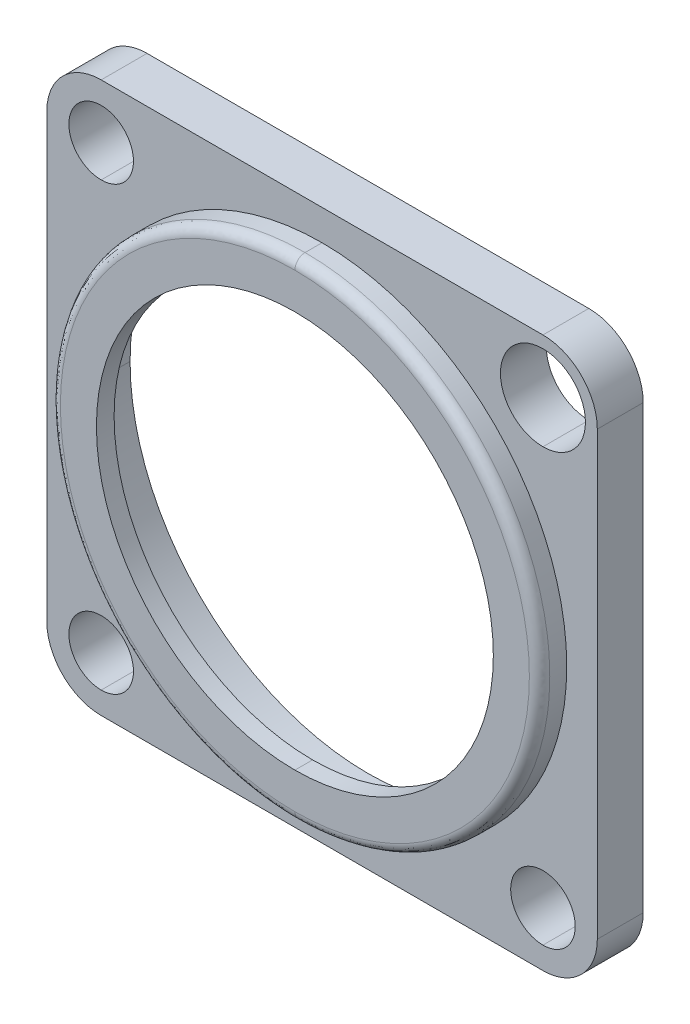
ISO-10303-21;
HEADER;
FILE_DESCRIPTION(('STEP AP214'),'2;1');
FILE_NAME('part.step','',(''),(''),'','','');
FILE_SCHEMA(('AUTOMOTIVE_DESIGN { 1 0 10303 214 1 1 1 1 }'));
ENDSEC;
DATA;
#1=APPLICATION_CONTEXT('core data for automotive mechanical design processes');
#2=APPLICATION_PROTOCOL_DEFINITION('international standard','automotive_design',2000,#1);
#3=PRODUCT_CONTEXT('',#1,'mechanical');
#4=PRODUCT('Part','Part','',(#3));
#5=PRODUCT_RELATED_PRODUCT_CATEGORY('part','',(#4));
#6=PRODUCT_DEFINITION_FORMATION('','',#4);
#7=PRODUCT_DEFINITION_CONTEXT('part definition',#1,'design');
#8=PRODUCT_DEFINITION('design','',#6,#7);
#9=PRODUCT_DEFINITION_SHAPE('','',#8);
#10=(LENGTH_UNIT() NAMED_UNIT(*) SI_UNIT(.MILLI.,.METRE.));
#11=(NAMED_UNIT(*) PLANE_ANGLE_UNIT() SI_UNIT($,.RADIAN.));
#12=(NAMED_UNIT(*) SI_UNIT($,.STERADIAN.) SOLID_ANGLE_UNIT());
#13=UNCERTAINTY_MEASURE_WITH_UNIT(LENGTH_MEASURE(1.E-05),#10,'distance_accuracy_value','');
#14=(GEOMETRIC_REPRESENTATION_CONTEXT(3) GLOBAL_UNCERTAINTY_ASSIGNED_CONTEXT((#13)) GLOBAL_UNIT_ASSIGNED_CONTEXT((#10,
#11,#12)) REPRESENTATION_CONTEXT('',''));
#15=CARTESIAN_POINT('',(0.,0.,0.));
#16=DIRECTION('',(0.,0.,1.));
#17=DIRECTION('',(1.,0.,0.));
#18=AXIS2_PLACEMENT_3D('',#15,#16,#17);
#19=CARTESIAN_POINT('',(0.,0.,-375.099458625867));
#20=DIRECTION('',(0.,0.,1.));
#21=DIRECTION('',(-1.,0.,0.));
#22=AXIS2_PLACEMENT_3D('',#19,#20,#21);
#23=TOROIDAL_SURFACE('',#22,68.,2.);
#24=CARTESIAN_POINT('',(68.,0.,-375.099458625867));
#25=DIRECTION('',(0.,-1.,0.));
#26=DIRECTION('',(1.,0.,0.));
#27=AXIS2_PLACEMENT_3D('',#24,#25,#26);
#28=CIRCLE('',#27,2.);
#29=CARTESIAN_POINT('',(70.,0.,-375.099458625867));
#30=VERTEX_POINT('',#29);
#31=CARTESIAN_POINT('',(68.,0.,-373.099458625867));
#32=VERTEX_POINT('',#31);
#33=EDGE_CURVE('E395',#30,#32,#28,.T.);
#34=ORIENTED_EDGE('',*,*,#33,.F.);
#35=CARTESIAN_POINT('',(0.,0.,-375.099458625867));
#36=DIRECTION('',(0.,0.,1.));
#37=DIRECTION('',(0.,-1.,0.));
#38=AXIS2_PLACEMENT_3D('',#35,#36,#37);
#39=CIRCLE('',#38,70.);
#40=CARTESIAN_POINT('',(-70.,0.,-375.099458625867));
#41=VERTEX_POINT('',#40);
#42=EDGE_CURVE('E28',#41,#30,#39,.T.);
#43=ORIENTED_EDGE('',*,*,#42,.F.);
#44=CARTESIAN_POINT('',(-68.,0.,-375.099458625867));
#45=DIRECTION('',(0.,1.,0.));
#46=DIRECTION('',(0.,0.,1.));
#47=AXIS2_PLACEMENT_3D('',#44,#45,#46);
#48=CIRCLE('',#47,2.);
#49=CARTESIAN_POINT('',(-68.,0.,-373.099458625867));
#50=VERTEX_POINT('',#49);
#51=EDGE_CURVE('E352',#41,#50,#48,.T.);
#52=ORIENTED_EDGE('',*,*,#51,.T.);
#53=CARTESIAN_POINT('',(0.,0.,-373.099458625867));
#54=DIRECTION('',(0.,0.,-1.));
#55=DIRECTION('',(0.,-1.,0.));
#56=AXIS2_PLACEMENT_3D('',#53,#54,#55);
#57=CIRCLE('',#56,68.);
#58=EDGE_CURVE('E10',#32,#50,#57,.T.);
#59=ORIENTED_EDGE('',*,*,#58,.F.);
#60=EDGE_LOOP('',(#34,#43,#52,#59));
#61=FACE_BOUND('',#60,.T.);
#62=ADVANCED_FACE('F16',(#61),#23,.F.);
#63=CARTESIAN_POINT('',(0.,70.,-373.099458625867));
#64=DIRECTION('',(0.,0.,1.));
#65=DIRECTION('',(1.,0.,0.));
#66=AXIS2_PLACEMENT_3D('',#63,#64,#65);
#67=PLANE('',#66);
#68=CARTESIAN_POINT('',(0.,0.,-373.099458625867));
#69=DIRECTION('',(0.,0.,-1.));
#70=DIRECTION('',(1.,0.,0.));
#71=AXIS2_PLACEMENT_3D('',#68,#69,#70);
#72=CIRCLE('',#71,58.4);
#73=CARTESIAN_POINT('',(0.,58.4,-373.099458625867));
#74=VERTEX_POINT('',#73);
#75=CARTESIAN_POINT('',(0.,-58.4,-373.099458625867));
#76=VERTEX_POINT('',#75);
#77=EDGE_CURVE('E194',#74,#76,#72,.T.);
#78=ORIENTED_EDGE('',*,*,#77,.F.);
#79=CARTESIAN_POINT('',(0.,0.,-373.099458625867));
#80=DIRECTION('',(0.,0.,-1.));
#81=DIRECTION('',(1.,0.,0.));
#82=AXIS2_PLACEMENT_3D('',#79,#80,#81);
#83=CIRCLE('',#82,58.4);
#84=EDGE_CURVE('E438',#76,#74,#83,.T.);
#85=ORIENTED_EDGE('',*,*,#84,.F.);
#86=EDGE_LOOP('',(#78,#85));
#87=FACE_BOUND('',#86,.T.);
#88=CARTESIAN_POINT('',(0.,0.,-373.099458625867));
#89=DIRECTION('',(0.,0.,-1.));
#90=DIRECTION('',(0.,-1.,0.));
#91=AXIS2_PLACEMENT_3D('',#88,#89,#90);
#92=CIRCLE('',#91,68.);
#93=EDGE_CURVE('E379',#50,#32,#92,.T.);
#94=ORIENTED_EDGE('',*,*,#93,.T.);
#95=ORIENTED_EDGE('',*,*,#58,.T.);
#96=EDGE_LOOP('',(#94,#95));
#97=FACE_BOUND('',#96,.T.);
#98=ADVANCED_FACE('F627',(#87,#97),#67,.F.);
#99=CARTESIAN_POINT('',(0.,0.,-375.899623049439));
#100=DIRECTION('',(0.,0.,1.));
#101=DIRECTION('',(-1.,0.,0.));
#102=AXIS2_PLACEMENT_3D('',#99,#100,#101);
#103=CYLINDRICAL_SURFACE('',#102,70.);
#104=DIRECTION('',(0.,0.,1.));
#105=VECTOR('',#104,1.);
#106=CARTESIAN_POINT('',(70.,0.,-375.899623049439));
#107=LINE('',#106,#105);
#108=CARTESIAN_POINT('',(70.,0.,-389.399623049439));
#109=VERTEX_POINT('',#108);
#110=EDGE_CURVE('E351',#109,#30,#107,.T.);
#111=ORIENTED_EDGE('',*,*,#110,.F.);
#112=CARTESIAN_POINT('',(0.,0.,-389.399623049439));
#113=DIRECTION('',(0.,0.,-1.));
#114=DIRECTION('',(-1.,0.,0.));
#115=AXIS2_PLACEMENT_3D('',#112,#113,#114);
#116=CIRCLE('',#115,70.);
#117=CARTESIAN_POINT('',(-70.,0.,-389.399623049439));
#118=VERTEX_POINT('',#117);
#119=EDGE_CURVE('E296',#109,#118,#116,.T.);
#120=ORIENTED_EDGE('',*,*,#119,.T.);
#121=DIRECTION('',(0.,0.,1.));
#122=VECTOR('',#121,1.);
#123=CARTESIAN_POINT('',(-70.,0.,-375.899623049439));
#124=LINE('',#123,#122);
#125=EDGE_CURVE('E369',#118,#41,#124,.T.);
#126=ORIENTED_EDGE('',*,*,#125,.T.);
#127=ORIENTED_EDGE('',*,*,#42,.T.);
#128=EDGE_LOOP('',(#111,#120,#126,#127));
#129=FACE_BOUND('',#128,.T.);
#130=ADVANCED_FACE('F617',(#129),#103,.F.);
#131=CARTESIAN_POINT('',(0.,0.,-373.399623049445));
#132=DIRECTION('',(0.,0.,-1.));
#133=DIRECTION('',(0.,1.,0.));
#134=AXIS2_PLACEMENT_3D('',#131,#132,#133);
#135=CYLINDRICAL_SURFACE('',#134,72.0027639147435);
#136=DIRECTION('',(0.,0.,-1.));
#137=VECTOR('',#136,1.);
#138=CARTESIAN_POINT('',(0.,-72.0027639147435,-373.399623049445));
#139=LINE('',#138,#137);
#140=CARTESIAN_POINT('',(0.,-72.0027639147435,-370.899623049445));
#141=VERTEX_POINT('',#140);
#142=CARTESIAN_POINT('',(0.,-72.0027639147435,-375.899623049439));
#143=VERTEX_POINT('',#142);
#144=EDGE_CURVE('E375',#141,#143,#139,.T.);
#145=ORIENTED_EDGE('',*,*,#144,.F.);
#146=CARTESIAN_POINT('',(0.,0.,-370.899623049445));
#147=DIRECTION('',(0.,0.,-1.));
#148=DIRECTION('',(1.,0.,0.));
#149=AXIS2_PLACEMENT_3D('',#146,#147,#148);
#150=CIRCLE('',#149,72.0027639147435);
#151=CARTESIAN_POINT('',(0.,72.0027639147435,-370.899623049445));
#152=VERTEX_POINT('',#151);
#153=EDGE_CURVE('E215',#141,#152,#150,.T.);
#154=ORIENTED_EDGE('',*,*,#153,.T.);
#155=DIRECTION('',(0.,0.,-1.));
#156=VECTOR('',#155,1.);
#157=CARTESIAN_POINT('',(0.,72.0027639147435,-373.399623049445));
#158=LINE('',#157,#156);
#159=CARTESIAN_POINT('',(0.,72.0027639147435,-375.899623049439));
#160=VERTEX_POINT('',#159);
#161=EDGE_CURVE('E374',#152,#160,#158,.T.);
#162=ORIENTED_EDGE('',*,*,#161,.T.);
#163=CARTESIAN_POINT('',(0.,0.,-375.899623049439));
#164=DIRECTION('',(0.,0.,1.));
#165=DIRECTION('',(0.,1.,0.));
#166=AXIS2_PLACEMENT_3D('',#163,#164,#165);
#167=CIRCLE('',#166,72.0027639147435);
#168=EDGE_CURVE('E174',#160,#143,#167,.T.);
#169=ORIENTED_EDGE('',*,*,#168,.T.);
#170=EDGE_LOOP('',(#145,#154,#162,#169));
#171=FACE_BOUND('',#170,.T.);
#172=ADVANCED_FACE('F584',(#171),#135,.T.);
#173=CARTESIAN_POINT('',(0.,-69.0027639148926,-367.899623049444));
#174=CARTESIAN_POINT('',(-69.0027639148926,-69.0027639148926,-367.899623049444));
#175=CARTESIAN_POINT('',(-69.0027639148926,0.,-367.899623049444));
#176=CARTESIAN_POINT('',(-69.0027639148926,69.0027639148926,-367.899623049444));
#177=CARTESIAN_POINT('',(0.,69.0027639148926,-367.899623049444));
#178=CARTESIAN_POINT('',(0.,-72.0027639147442,-367.899623049444));
#179=CARTESIAN_POINT('',(-72.0027639147441,-72.0027639147441,-367.899623049444));
#180=CARTESIAN_POINT('',(-72.0027639147442,0.,-367.899623049444));
#181=CARTESIAN_POINT('',(-72.0027639147441,72.0027639147441,-367.899623049444));
#182=CARTESIAN_POINT('',(0.,72.0027639147442,-367.899623049444));
#183=CARTESIAN_POINT('',(0.,-72.0027639147435,-370.899623049444));
#184=CARTESIAN_POINT('',(-72.0027639147435,-72.0027639147435,-370.899623049444));
#185=CARTESIAN_POINT('',(-72.0027639147435,0.,-370.899623049444));
#186=CARTESIAN_POINT('',(-72.0027639147435,72.0027639147435,-370.899623049444));
#187=CARTESIAN_POINT('',(0.,72.0027639147435,-370.899623049444));
#188=(BOUNDED_SURFACE() B_SPLINE_SURFACE(2,2,((#173,#174,#175,#176,#177),(#178,#179,#180,#181,
#182),(#183,#184,#185,#186,#187)),.UNSPECIFIED.,.F.,.F.,.F.) B_SPLINE_SURFACE_WITH_KNOTS((3,3),
(3,2,3),(0.,1.57079632679505),(3.14159265358979,4.71238898038469,6.28318530717959),
.UNSPECIFIED.) GEOMETRIC_REPRESENTATION_ITEM() RATIONAL_B_SPLINE_SURFACE(((1.,0.707106781186548,
1.,0.707106781186548,1.),(0.707106781186486,0.499999999999957,0.707106781186486,
0.499999999999957,0.707106781186486),(1.,0.707106781186548,1.,0.707106781186548,1.))) REPRESENTATION_ITEM('') SURFACE());
#189=CARTESIAN_POINT('',(-3.38261625039226E-13,-69.0027639148925,-367.899623049444));
#190=CARTESIAN_POINT('',(-3.45458398745103E-13,-72.0027639147441,-367.899623049444));
#191=CARTESIAN_POINT('',(0.,-72.0027639147434,-370.899623049445));
#192=(BOUNDED_CURVE() B_SPLINE_CURVE(2,(#189,#190,#191),.UNSPECIFIED.,.F.,
.F.) B_SPLINE_CURVE_WITH_KNOTS((3,3),(0.,1.57079632679505),
.UNSPECIFIED.) CURVE() GEOMETRIC_REPRESENTATION_ITEM() RATIONAL_B_SPLINE_CURVE((1.,
0.707106781186485,1.)) REPRESENTATION_ITEM(''));
#193=CARTESIAN_POINT('',(-3.38261625039227E-13,-69.0027639148926,-367.899623049444));
#194=VERTEX_POINT('',#193);
#195=EDGE_CURVE('E343',#194,#141,#192,.T.);
#196=CARTESIAN_POINT('',(0.,0.,-367.899623049444));
#197=DIRECTION('',(0.,0.,-1.));
#198=DIRECTION('',(1.,0.,0.));
#199=AXIS2_PLACEMENT_3D('',#196,#197,#198);
#200=CIRCLE('',#199,69.0027639148926);
#201=CARTESIAN_POINT('',(0.,69.0027639148926,-367.899623049444));
#202=VERTEX_POINT('',#201);
#203=EDGE_CURVE('E204',#194,#202,#200,.T.);
#204=CARTESIAN_POINT('',(0.,69.0027639148926,-367.899623049444));
#205=CARTESIAN_POINT('',(0.,72.0027639147442,-367.899623049444));
#206=CARTESIAN_POINT('',(0.,72.0027639147435,-370.899623049445));
#207=(BOUNDED_CURVE() B_SPLINE_CURVE(2,(#204,#205,#206),.UNSPECIFIED.,.F.,
.F.) B_SPLINE_CURVE_WITH_KNOTS((3,3),(0.,1.57079632679505),
.UNSPECIFIED.) CURVE() GEOMETRIC_REPRESENTATION_ITEM() RATIONAL_B_SPLINE_CURVE((1.,
0.707106781186486,1.)) REPRESENTATION_ITEM(''));
#208=EDGE_CURVE('E365',#202,#152,#207,.T.);
#209=ORIENTED_EDGE('',*,*,#195,.F.);
#210=ORIENTED_EDGE('',*,*,#203,.T.);
#211=ORIENTED_EDGE('',*,*,#208,.T.);
#212=ORIENTED_EDGE('',*,*,#153,.F.);
#213=EDGE_LOOP('',(#209,#210,#211,#212));
#214=FACE_BOUND('',#213,.T.);
#215=ADVANCED_FACE('F655',(#214),#188,.F.);
#216=CARTESIAN_POINT('',(0.,58.4,-367.899623049446));
#217=DIRECTION('',(0.,0.,-1.));
#218=DIRECTION('',(0.,-1.,0.));
#219=AXIS2_PLACEMENT_3D('',#216,#217,#218);
#220=PLANE('',#219);
#221=CARTESIAN_POINT('',(0.,0.,-367.899623049446));
#222=DIRECTION('',(0.,0.,-1.));
#223=DIRECTION('',(1.,0.,0.));
#224=AXIS2_PLACEMENT_3D('',#221,#222,#223);
#225=CIRCLE('',#224,58.4);
#226=CARTESIAN_POINT('',(0.,58.4,-367.899623049446));
#227=VERTEX_POINT('',#226);
#228=CARTESIAN_POINT('',(0.,-58.4,-367.899623049446));
#229=VERTEX_POINT('',#228);
#230=EDGE_CURVE('E191',#227,#229,#225,.T.);
#231=ORIENTED_EDGE('',*,*,#230,.T.);
#232=CARTESIAN_POINT('',(0.,0.,-367.899623049446));
#233=DIRECTION('',(0.,0.,-1.));
#234=DIRECTION('',(1.,0.,0.));
#235=AXIS2_PLACEMENT_3D('',#232,#233,#234);
#236=CIRCLE('',#235,58.4);
#237=EDGE_CURVE('E428',#229,#227,#236,.T.);
#238=ORIENTED_EDGE('',*,*,#237,.T.);
#239=EDGE_LOOP('',(#231,#238));
#240=FACE_BOUND('',#239,.T.);
#241=CARTESIAN_POINT('',(0.,0.,-367.899623049444));
#242=DIRECTION('',(0.,0.,-1.));
#243=DIRECTION('',(1.,0.,0.));
#244=AXIS2_PLACEMENT_3D('',#241,#242,#243);
#245=CIRCLE('',#244,69.0027639148926);
#246=EDGE_CURVE('E339',#202,#194,#245,.T.);
#247=ORIENTED_EDGE('',*,*,#246,.F.);
#248=ORIENTED_EDGE('',*,*,#203,.F.);
#249=EDGE_LOOP('',(#247,#248));
#250=FACE_BOUND('',#249,.T.);
#251=ADVANCED_FACE('F694',(#240,#250),#220,.F.);
#252=CARTESIAN_POINT('',(0.,0.,-370.499540837656));
#253=DIRECTION('',(0.,0.,-1.));
#254=DIRECTION('',(0.,1.,0.));
#255=AXIS2_PLACEMENT_3D('',#252,#253,#254);
#256=CYLINDRICAL_SURFACE('',#255,58.4);
#257=DIRECTION('',(0.,0.,-1.));
#258=VECTOR('',#257,1.);
#259=CARTESIAN_POINT('',(0.,-58.4,-370.499540837656));
#260=LINE('',#259,#258);
#261=EDGE_CURVE('E434',#229,#76,#260,.T.);
#262=ORIENTED_EDGE('',*,*,#261,.F.);
#263=ORIENTED_EDGE('',*,*,#230,.F.);
#264=DIRECTION('',(0.,0.,-1.));
#265=VECTOR('',#264,1.);
#266=CARTESIAN_POINT('',(0.,58.4,-370.499540837656));
#267=LINE('',#266,#265);
#268=EDGE_CURVE('E424',#227,#74,#267,.T.);
#269=ORIENTED_EDGE('',*,*,#268,.T.);
#270=ORIENTED_EDGE('',*,*,#77,.T.);
#271=EDGE_LOOP('',(#262,#263,#269,#270));
#272=FACE_BOUND('',#271,.T.);
#273=ADVANCED_FACE('F691',(#272),#256,.F.);
#274=CARTESIAN_POINT('',(64.9967583992041,65.0038513175326,-375.899623049431));
#275=DIRECTION('',(-1.2730558495364E-13,0.,1.));
#276=DIRECTION('',(9.96744036307895E-06,-0.999999999950325,0.));
#277=AXIS2_PLACEMENT_3D('',#274,#275,#276);
#278=CYLINDRICAL_SURFACE('',#277,12.5);
#279=DIRECTION('',(-1.27305573490351E-13,0.,1.));
#280=VECTOR('',#279,1.);
#281=CARTESIAN_POINT('',(64.9966338061996,77.5038513169117,-375.899623049431));
#282=LINE('',#281,#280);
#283=CARTESIAN_POINT('',(64.9966338062004,77.5038513169116,-389.399623049431));
#284=VERTEX_POINT('',#283);
#285=CARTESIAN_POINT('',(64.9966338062004,77.5038513169117,-375.899623049431));
#286=VERTEX_POINT('',#285);
#287=EDGE_CURVE('E423',#284,#286,#282,.T.);
#288=ORIENTED_EDGE('',*,*,#287,.F.);
#289=CARTESIAN_POINT('',(64.9967583992076,65.0038513175325,-389.399623049431));
#290=DIRECTION('',(1.27309964624471E-13,0.,-1.));
#291=DIRECTION('',(9.96744036307895E-06,-0.999999999950325,0.));
#292=AXIS2_PLACEMENT_3D('',#289,#290,#291);
#293=CIRCLE('',#292,12.5);
#294=CARTESIAN_POINT('',(64.9968829922121,52.5038513181534,-389.399623049431));
#295=VERTEX_POINT('',#294);
#296=EDGE_CURVE('E157',#284,#295,#293,.T.);
#297=ORIENTED_EDGE('',*,*,#296,.T.);
#298=DIRECTION('',(-1.27305573490351E-13,0.,1.));
#299=VECTOR('',#298,1.);
#300=CARTESIAN_POINT('',(64.9968829922086,52.5038513181535,-375.899623049431));
#301=LINE('',#300,#299);
#302=CARTESIAN_POINT('',(64.9968829922086,52.5038513181535,-375.899623049431));
#303=VERTEX_POINT('',#302);
#304=EDGE_CURVE('E219',#295,#303,#301,.T.);
#305=ORIENTED_EDGE('',*,*,#304,.T.);
#306=CARTESIAN_POINT('',(64.9967583992041,65.0038513175326,-375.899623049431));
#307=DIRECTION('',(-1.27309964624471E-13,0.,1.));
#308=DIRECTION('',(9.96744036307895E-06,-0.999999999950325,0.));
#309=AXIS2_PLACEMENT_3D('',#306,#307,#308);
#310=CIRCLE('',#309,12.5);
#311=EDGE_CURVE('E170',#303,#286,#310,.T.);
#312=ORIENTED_EDGE('',*,*,#311,.T.);
#313=EDGE_LOOP('',(#288,#297,#305,#312));
#314=FACE_BOUND('',#313,.T.);
#315=ADVANCED_FACE('F457',(#314),#278,.F.);
#316=CARTESIAN_POINT('',(-65.0032415943379,65.0025555502847,-375.899623049448));
#317=DIRECTION('',(-1.27305598931848E-13,0.,1.));
#318=DIRECTION('',(9.96744036284522E-06,-0.999999999950325,0.));
#319=AXIS2_PLACEMENT_3D('',#316,#317,#318);
#320=CYLINDRICAL_SURFACE('',#319,9.5);
#321=DIRECTION('',(-1.27305573490351E-13,0.,1.));
#322=VECTOR('',#321,1.);
#323=CARTESIAN_POINT('',(-65.0033362850214,74.5025555498128,-375.899623049448));
#324=LINE('',#323,#322);
#325=CARTESIAN_POINT('',(-65.0033362850205,74.5025555498128,-389.399623049448));
#326=VERTEX_POINT('',#325);
#327=CARTESIAN_POINT('',(-65.0033362850205,74.5025555498128,-375.899623049448));
#328=VERTEX_POINT('',#327);
#329=EDGE_CURVE('E235',#326,#328,#324,.T.);
#330=ORIENTED_EDGE('',*,*,#329,.F.);
#331=CARTESIAN_POINT('',(-65.0032415943344,65.0025555502847,-389.399623049448));
#332=DIRECTION('',(1.27309965784824E-13,0.,-1.));
#333=DIRECTION('',(9.96744036284522E-06,-0.999999999950325,0.));
#334=AXIS2_PLACEMENT_3D('',#331,#332,#333);
#335=CIRCLE('',#334,9.5);
#336=CARTESIAN_POINT('',(-65.003146903651,55.5025555507566,-389.399623049448));
#337=VERTEX_POINT('',#336);
#338=EDGE_CURVE('E263',#326,#337,#335,.T.);
#339=ORIENTED_EDGE('',*,*,#338,.T.);
#340=DIRECTION('',(-1.27305573490351E-13,0.,1.));
#341=VECTOR('',#340,1.);
#342=CARTESIAN_POINT('',(-65.0031469036545,55.5025555507566,-375.899623049448));
#343=LINE('',#342,#341);
#344=CARTESIAN_POINT('',(-65.0031469036545,55.5025555507566,-375.899623049448));
#345=VERTEX_POINT('',#344);
#346=EDGE_CURVE('E230',#337,#345,#343,.T.);
#347=ORIENTED_EDGE('',*,*,#346,.T.);
#348=CARTESIAN_POINT('',(-65.0032415943379,65.0025555502847,-375.899623049448));
#349=DIRECTION('',(1.27309965784824E-13,0.,-1.));
#350=DIRECTION('',(9.96744036284522E-06,-0.999999999950325,0.));
#351=AXIS2_PLACEMENT_3D('',#348,#349,#350);
#352=CIRCLE('',#351,9.5);
#353=EDGE_CURVE('E165',#328,#345,#352,.T.);
#354=ORIENTED_EDGE('',*,*,#353,.F.);
#355=EDGE_LOOP('',(#330,#339,#347,#354));
#356=FACE_BOUND('',#355,.T.);
#357=ADVANCED_FACE('F686',(#356),#320,.F.);
#358=CARTESIAN_POINT('',(-65.0019458270909,-64.9974444432576,-375.899623049447));
#359=DIRECTION('',(-1.27305598931848E-13,0.,1.));
#360=DIRECTION('',(9.96744036284523E-06,-0.999999999950325,0.));
#361=AXIS2_PLACEMENT_3D('',#358,#359,#360);
#362=CYLINDRICAL_SURFACE('',#361,9.5);
#363=DIRECTION('',(-1.27305573490351E-13,0.,1.));
#364=VECTOR('',#363,1.);
#365=CARTESIAN_POINT('',(-65.0020405177744,-55.4974444437295,-375.899623049447));
#366=LINE('',#365,#364);
#367=CARTESIAN_POINT('',(-65.0020405177735,-55.4974444437295,-389.399623049447));
#368=VERTEX_POINT('',#367);
#369=CARTESIAN_POINT('',(-65.0020405177735,-55.4974444437295,-375.899623049447));
#370=VERTEX_POINT('',#369);
#371=EDGE_CURVE('E229',#368,#370,#366,.T.);
#372=ORIENTED_EDGE('',*,*,#371,.F.);
#373=CARTESIAN_POINT('',(-65.0019458270874,-64.9974444432576,-389.399623049447));
#374=DIRECTION('',(1.27309965784824E-13,0.,-1.));
#375=DIRECTION('',(9.96744036284523E-06,-0.999999999950325,0.));
#376=AXIS2_PLACEMENT_3D('',#373,#374,#375);
#377=CIRCLE('',#376,9.5);
#378=CARTESIAN_POINT('',(-65.001851136404,-74.4974444427857,-389.399623049447));
#379=VERTEX_POINT('',#378);
#380=EDGE_CURVE('E259',#368,#379,#377,.T.);
#381=ORIENTED_EDGE('',*,*,#380,.T.);
#382=DIRECTION('',(-1.27305573490351E-13,0.,1.));
#383=VECTOR('',#382,1.);
#384=CARTESIAN_POINT('',(-65.0018511364075,-74.4974444427857,-375.899623049447));
#385=LINE('',#384,#383);
#386=CARTESIAN_POINT('',(-65.0018511364075,-74.4974444427857,-375.899623049447));
#387=VERTEX_POINT('',#386);
#388=EDGE_CURVE('E243',#379,#387,#385,.T.);
#389=ORIENTED_EDGE('',*,*,#388,.T.);
#390=CARTESIAN_POINT('',(-65.0019458270909,-64.9974444432576,-375.899623049447));
#391=DIRECTION('',(1.27309965784824E-13,0.,-1.));
#392=DIRECTION('',(9.96744036284523E-06,-0.999999999950325,0.));
#393=AXIS2_PLACEMENT_3D('',#390,#391,#392);
#394=CIRCLE('',#393,9.5);
#395=EDGE_CURVE('E162',#370,#387,#394,.T.);
#396=ORIENTED_EDGE('',*,*,#395,.F.);
#397=EDGE_LOOP('',(#372,#381,#389,#396));
#398=FACE_BOUND('',#397,.T.);
#399=ADVANCED_FACE('F508',(#398),#362,.F.);
#400=CARTESIAN_POINT('',(64.9980541664513,-64.9961486760094,-375.899623049431));
#401=DIRECTION('',(-1.27305598931848E-13,0.,1.));
#402=DIRECTION('',(9.96744036284523E-06,-0.999999999950325,0.));
#403=AXIS2_PLACEMENT_3D('',#400,#401,#402);
#404=CYLINDRICAL_SURFACE('',#403,9.5);
#405=DIRECTION('',(-1.27305573490351E-13,0.,1.));
#406=VECTOR('',#405,1.);
#407=CARTESIAN_POINT('',(64.9979594757679,-55.4961486764813,-375.899623049431));
#408=LINE('',#407,#406);
#409=CARTESIAN_POINT('',(64.9979594757687,-55.4961486764814,-389.399623049431));
#410=VERTEX_POINT('',#409);
#411=CARTESIAN_POINT('',(64.9979594757687,-55.4961486764813,-375.899623049431));
#412=VERTEX_POINT('',#411);
#413=EDGE_CURVE('E258',#410,#412,#408,.T.);
#414=ORIENTED_EDGE('',*,*,#413,.F.);
#415=CARTESIAN_POINT('',(64.9980541664548,-64.9961486760095,-389.399623049431));
#416=DIRECTION('',(1.27309965784824E-13,0.,-1.));
#417=DIRECTION('',(9.96744036284523E-06,-0.999999999950325,0.));
#418=AXIS2_PLACEMENT_3D('',#415,#416,#417);
#419=CIRCLE('',#418,9.5);
#420=CARTESIAN_POINT('',(64.9981488571383,-74.4961486755376,-389.399623049431));
#421=VERTEX_POINT('',#420);
#422=EDGE_CURVE('E264',#410,#421,#419,.T.);
#423=ORIENTED_EDGE('',*,*,#422,.T.);
#424=DIRECTION('',(-1.27305573490351E-13,0.,1.));
#425=VECTOR('',#424,1.);
#426=CARTESIAN_POINT('',(64.9981488571347,-74.4961486755375,-375.899623049431));
#427=LINE('',#426,#425);
#428=CARTESIAN_POINT('',(64.9981488571347,-74.4961486755375,-375.899623049431));
#429=VERTEX_POINT('',#428);
#430=EDGE_CURVE('E272',#421,#429,#427,.T.);
#431=ORIENTED_EDGE('',*,*,#430,.T.);
#432=CARTESIAN_POINT('',(64.9980541664513,-64.9961486760094,-375.899623049431));
#433=DIRECTION('',(1.27309965784824E-13,0.,-1.));
#434=DIRECTION('',(9.96744036284523E-06,-0.999999999950325,0.));
#435=AXIS2_PLACEMENT_3D('',#432,#433,#434);
#436=CIRCLE('',#435,9.5);
#437=EDGE_CURVE('E166',#412,#429,#436,.T.);
#438=ORIENTED_EDGE('',*,*,#437,.F.);
#439=EDGE_LOOP('',(#414,#423,#431,#438));
#440=FACE_BOUND('',#439,.T.);
#441=ADVANCED_FACE('F525',(#440),#404,.F.);
#442=CARTESIAN_POINT('',(-65.0032415943392,65.0025555502859,-375.899623049439));
#443=DIRECTION('',(0.,0.,1.));
#444=DIRECTION('',(-0.999999999950325,-9.96744036179525E-06,0.));
#445=AXIS2_PLACEMENT_3D('',#442,#443,#444);
#446=CYLINDRICAL_SURFACE('',#445,16.);
#447=CARTESIAN_POINT('',(-65.0032415943392,65.0025555502859,-375.899623049439));
#448=DIRECTION('',(0.,0.,-1.));
#449=DIRECTION('',(-0.999999999950325,-9.96744036179525E-06,0.));
#450=AXIS2_PLACEMENT_3D('',#447,#448,#449);
#451=CIRCLE('',#450,16.);
#452=CARTESIAN_POINT('',(-81.0032415935442,65.0023960712406,-375.899623049439));
#453=VERTEX_POINT('',#452);
#454=CARTESIAN_POINT('',(-65.003401073385,81.0025555494911,-375.899623049439));
#455=VERTEX_POINT('',#454);
#456=EDGE_CURVE('E161',#453,#455,#451,.T.);
#457=ORIENTED_EDGE('',*,*,#456,.T.);
#458=DIRECTION('',(0.,0.,-1.));
#459=VECTOR('',#458,1.);
#460=CARTESIAN_POINT('',(-65.003401073385,81.0025555494911,-375.899623049439));
#461=LINE('',#460,#459);
#462=CARTESIAN_POINT('',(-65.003401073385,81.0025555494911,-389.399623049439));
#463=VERTEX_POINT('',#462);
#464=EDGE_CURVE('E41',#455,#463,#461,.T.);
#465=ORIENTED_EDGE('',*,*,#464,.T.);
#466=CARTESIAN_POINT('',(-65.0032415943392,65.0025555502859,-389.399623049439));
#467=DIRECTION('',(0.,0.,1.));
#468=DIRECTION('',(-0.999999999950325,-9.96744036179525E-06,0.));
#469=AXIS2_PLACEMENT_3D('',#466,#467,#468);
#470=CIRCLE('',#469,16.);
#471=CARTESIAN_POINT('',(-81.0032415935442,65.0023960712406,-389.399623049439));
#472=VERTEX_POINT('',#471);
#473=EDGE_CURVE('E280',#463,#472,#470,.T.);
#474=ORIENTED_EDGE('',*,*,#473,.T.);
#475=DIRECTION('',(0.,0.,-1.));
#476=VECTOR('',#475,1.);
#477=CARTESIAN_POINT('',(-81.0032415935442,65.0023960712406,-375.899623049439));
#478=LINE('',#477,#476);
#479=EDGE_CURVE('E180',#453,#472,#478,.T.);
#480=ORIENTED_EDGE('',*,*,#479,.F.);
#481=EDGE_LOOP('',(#457,#465,#474,#480));
#482=FACE_BOUND('',#481,.T.);
#483=ADVANCED_FACE('F540',(#482),#446,.T.);
#484=CARTESIAN_POINT('',(64.9965989201572,81.0038513167384,-375.899623049439));
#485=DIRECTION('',(9.9674403614905E-06,-0.999999999950325,0.));
#486=DIRECTION('',(0.,0.,-1.));
#487=AXIS2_PLACEMENT_3D('',#484,#485,#486);
#488=PLANE('',#487);
#489=DIRECTION('',(0.999999999950325,9.9674403614905E-06,0.));
#490=VECTOR('',#489,1.);
#491=CARTESIAN_POINT('',(-65.0034010733849,81.0025555494914,-375.899623049439));
#492=LINE('',#491,#490);
#493=CARTESIAN_POINT('',(64.9965989201572,81.0038513167384,-375.899623049439));
#494=VERTEX_POINT('',#493);
#495=EDGE_CURVE('E140',#455,#494,#492,.T.);
#496=ORIENTED_EDGE('',*,*,#495,.T.);
#497=DIRECTION('',(0.,0.,-1.));
#498=VECTOR('',#497,1.);
#499=CARTESIAN_POINT('',(64.9965989201572,81.0038513167384,-375.899623049439));
#500=LINE('',#499,#498);
#501=CARTESIAN_POINT('',(64.9965989201572,81.0038513167384,-389.399623049439));
#502=VERTEX_POINT('',#501);
#503=EDGE_CURVE('E131',#494,#502,#500,.T.);
#504=ORIENTED_EDGE('',*,*,#503,.T.);
#505=DIRECTION('',(-0.999999999950325,-9.9674403614905E-06,0.));
#506=VECTOR('',#505,1.);
#507=CARTESIAN_POINT('',(-65.0034010733849,81.0025555494914,-389.399623049439));
#508=LINE('',#507,#506);
#509=EDGE_CURVE('E224',#502,#463,#508,.T.);
#510=ORIENTED_EDGE('',*,*,#509,.T.);
#511=ORIENTED_EDGE('',*,*,#464,.F.);
#512=EDGE_LOOP('',(#496,#504,#510,#511));
#513=FACE_BOUND('',#512,.T.);
#514=ADVANCED_FACE('F541',(#513),#488,.F.);
#515=CARTESIAN_POINT('',(64.996758399203,65.0038513175332,-375.899623049439));
#516=DIRECTION('',(0.,0.,1.));
#517=DIRECTION('',(-9.96744036613206E-06,0.999999999950325,0.));
#518=AXIS2_PLACEMENT_3D('',#515,#516,#517);
#519=CYLINDRICAL_SURFACE('',#518,16.);
#520=CARTESIAN_POINT('',(64.996758399203,65.0038513175332,-375.899623049439));
#521=DIRECTION('',(0.,0.,-1.));
#522=DIRECTION('',(-9.96744036613206E-06,0.999999999950325,0.));
#523=AXIS2_PLACEMENT_3D('',#520,#521,#522);
#524=CIRCLE('',#523,16.);
#525=CARTESIAN_POINT('',(80.9967583984083,65.0040107965791,-375.899623049439));
#526=VERTEX_POINT('',#525);
#527=EDGE_CURVE('E135',#494,#526,#524,.T.);
#528=ORIENTED_EDGE('',*,*,#527,.T.);
#529=DIRECTION('',(0.,0.,-1.));
#530=VECTOR('',#529,1.);
#531=CARTESIAN_POINT('',(80.9967583984083,65.0040107965791,-375.899623049439));
#532=LINE('',#531,#530);
#533=CARTESIAN_POINT('',(80.9967583984083,65.0040107965791,-389.399623049439));
#534=VERTEX_POINT('',#533);
#535=EDGE_CURVE('E118',#526,#534,#532,.T.);
#536=ORIENTED_EDGE('',*,*,#535,.T.);
#537=CARTESIAN_POINT('',(64.996758399203,65.0038513175332,-389.399623049439));
#538=DIRECTION('',(0.,0.,1.));
#539=DIRECTION('',(-9.96744036613206E-06,0.999999999950325,0.));
#540=AXIS2_PLACEMENT_3D('',#537,#538,#539);
#541=CIRCLE('',#540,16.);
#542=EDGE_CURVE('E221',#534,#502,#541,.T.);
#543=ORIENTED_EDGE('',*,*,#542,.T.);
#544=ORIENTED_EDGE('',*,*,#503,.F.);
#545=EDGE_LOOP('',(#528,#536,#543,#544));
#546=FACE_BOUND('',#545,.T.);
#547=ADVANCED_FACE('F136',(#546),#519,.T.);
#548=CARTESIAN_POINT('',(80.9980541656554,-64.9959891969624,-375.899623049439));
#549=DIRECTION('',(-0.999999999950325,-9.96744036217369E-06,0.));
#550=DIRECTION('',(-9.96744036217369E-06,0.999999999950325,0.));
#551=AXIS2_PLACEMENT_3D('',#548,#549,#550);
#552=PLANE('',#551);
#553=DIRECTION('',(9.96744036217369E-06,-0.999999999950325,0.));
#554=VECTOR('',#553,1.);
#555=CARTESIAN_POINT('',(80.9967583984083,65.0040107965791,-375.899623049439));
#556=LINE('',#555,#554);
#557=CARTESIAN_POINT('',(80.9980541656554,-64.9959891969624,-375.899623049439));
#558=VERTEX_POINT('',#557);
#559=EDGE_CURVE('E123',#526,#558,#556,.T.);
#560=ORIENTED_EDGE('',*,*,#559,.T.);
#561=DIRECTION('',(0.,0.,-1.));
#562=VECTOR('',#561,1.);
#563=CARTESIAN_POINT('',(80.9980541656554,-64.9959891969624,-375.899623049439));
#564=LINE('',#563,#562);
#565=CARTESIAN_POINT('',(80.9980541656554,-64.9959891969624,-389.399623049439));
#566=VERTEX_POINT('',#565);
#567=EDGE_CURVE('E132',#558,#566,#564,.T.);
#568=ORIENTED_EDGE('',*,*,#567,.T.);
#569=DIRECTION('',(-9.96744036217369E-06,0.999999999950325,0.));
#570=VECTOR('',#569,1.);
#571=CARTESIAN_POINT('',(80.9967583984083,65.0040107965791,-389.399623049439));
#572=LINE('',#571,#570);
#573=EDGE_CURVE('E126',#566,#534,#572,.T.);
#574=ORIENTED_EDGE('',*,*,#573,.T.);
#575=ORIENTED_EDGE('',*,*,#535,.F.);
#576=EDGE_LOOP('',(#560,#568,#574,#575));
#577=FACE_BOUND('',#576,.T.);
#578=ADVANCED_FACE('F120',(#577),#552,.F.);
#579=CARTESIAN_POINT('',(64.9980541664502,-64.9961486760083,-375.899623049439));
#580=DIRECTION('',(0.,0.,1.));
#581=DIRECTION('',(0.999999999950325,9.96744036873415E-06,0.));
#582=AXIS2_PLACEMENT_3D('',#579,#580,#581);
#583=CYLINDRICAL_SURFACE('',#582,16.);
#584=CARTESIAN_POINT('',(64.9980541664502,-64.9961486760083,-375.899623049439));
#585=DIRECTION('',(0.,0.,-1.));
#586=DIRECTION('',(0.999999999950325,9.96744036873415E-06,0.));
#587=AXIS2_PLACEMENT_3D('',#584,#585,#586);
#588=CIRCLE('',#587,16.);
#589=CARTESIAN_POINT('',(64.9982136454962,-80.9961486752138,-375.899623049439));
#590=VERTEX_POINT('',#589);
#591=EDGE_CURVE('E146',#558,#590,#588,.T.);
#592=ORIENTED_EDGE('',*,*,#591,.T.);
#593=DIRECTION('',(0.,0.,-1.));
#594=VECTOR('',#593,1.);
#595=CARTESIAN_POINT('',(64.9982136454962,-80.9961486752138,-375.899623049439));
#596=LINE('',#595,#594);
#597=CARTESIAN_POINT('',(64.9982136454962,-80.9961486752138,-389.399623049439));
#598=VERTEX_POINT('',#597);
#599=EDGE_CURVE('E183',#590,#598,#596,.T.);
#600=ORIENTED_EDGE('',*,*,#599,.T.);
#601=CARTESIAN_POINT('',(64.9980541664502,-64.9961486760083,-389.399623049439));
#602=DIRECTION('',(0.,0.,1.));
#603=DIRECTION('',(0.999999999950325,9.96744036873415E-06,0.));
#604=AXIS2_PLACEMENT_3D('',#601,#602,#603);
#605=CIRCLE('',#604,16.);
#606=EDGE_CURVE('E288',#598,#566,#605,.T.);
#607=ORIENTED_EDGE('',*,*,#606,.T.);
#608=ORIENTED_EDGE('',*,*,#567,.F.);
#609=EDGE_LOOP('',(#592,#600,#607,#608));
#610=FACE_BOUND('',#609,.T.);
#611=ADVANCED_FACE('F643',(#610),#583,.T.);
#612=CARTESIAN_POINT('',(-65.0017863480461,-80.9974444424605,-375.899623049439));
#613=DIRECTION('',(-9.96744035930419E-06,0.999999999950325,0.));
#614=DIRECTION('',(0.,0.,1.));
#615=AXIS2_PLACEMENT_3D('',#612,#613,#614);
#616=PLANE('',#615);
#617=DIRECTION('',(-0.999999999950325,-9.96744035930419E-06,0.));
#618=VECTOR('',#617,1.);
#619=CARTESIAN_POINT('',(64.9982136454962,-80.9961486752138,-375.899623049439));
#620=LINE('',#619,#618);
#621=CARTESIAN_POINT('',(-65.0017863480462,-80.9974444424598,-375.899623049439));
#622=VERTEX_POINT('',#621);
#623=EDGE_CURVE('E153',#590,#622,#620,.T.);
#624=ORIENTED_EDGE('',*,*,#623,.T.);
#625=DIRECTION('',(0.,0.,-1.));
#626=VECTOR('',#625,1.);
#627=CARTESIAN_POINT('',(-65.0017863480462,-80.9974444424598,-375.899623049439));
#628=LINE('',#627,#626);
#629=CARTESIAN_POINT('',(-65.0017863480461,-80.9974444424598,-389.399623049439));
#630=VERTEX_POINT('',#629);
#631=EDGE_CURVE('E179',#622,#630,#628,.T.);
#632=ORIENTED_EDGE('',*,*,#631,.T.);
#633=DIRECTION('',(0.999999999950325,9.96744035930419E-06,0.));
#634=VECTOR('',#633,1.);
#635=CARTESIAN_POINT('',(64.9982136454962,-80.9961486752138,-389.399623049439));
#636=LINE('',#635,#634);
#637=EDGE_CURVE('E292',#630,#598,#636,.T.);
#638=ORIENTED_EDGE('',*,*,#637,.T.);
#639=ORIENTED_EDGE('',*,*,#599,.F.);
#640=EDGE_LOOP('',(#624,#632,#638,#639));
#641=FACE_BOUND('',#640,.T.);
#642=ADVANCED_FACE('F645',(#641),#616,.F.);
#643=CARTESIAN_POINT('',(-65.0019458270918,-64.9974444432564,-375.899623049439));
#644=DIRECTION('',(0.,0.,1.));
#645=DIRECTION('',(0.662435719443942,-0.749118760681367,0.));
#646=AXIS2_PLACEMENT_3D('',#643,#644,#645);
#647=CYLINDRICAL_SURFACE('',#646,15.9999999999982);
#648=CARTESIAN_POINT('',(-65.0019458270918,-64.9974444432564,-375.899623049439));
#649=DIRECTION('',(0.,0.,-1.));
#650=DIRECTION('',(0.662435719443942,-0.749118760681367,0.));
#651=AXIS2_PLACEMENT_3D('',#648,#649,#650);
#652=CIRCLE('',#651,15.9999999999982);
#653=CARTESIAN_POINT('',(-81.0019458262971,-64.9976039223009,-375.899623049439));
#654=VERTEX_POINT('',#653);
#655=EDGE_CURVE('E330',#622,#654,#652,.T.);
#656=ORIENTED_EDGE('',*,*,#655,.T.);
#657=DIRECTION('',(0.,0.,-1.));
#658=VECTOR('',#657,1.);
#659=CARTESIAN_POINT('',(-81.0019458262971,-64.9976039223009,-375.899623049439));
#660=LINE('',#659,#658);
#661=CARTESIAN_POINT('',(-81.0019458262971,-64.9976039223009,-389.399623049439));
#662=VERTEX_POINT('',#661);
#663=EDGE_CURVE('E175',#654,#662,#660,.T.);
#664=ORIENTED_EDGE('',*,*,#663,.T.);
#665=CARTESIAN_POINT('',(-65.0019458270918,-64.9974444432564,-389.399623049439));
#666=DIRECTION('',(0.,0.,1.));
#667=DIRECTION('',(0.662435719443942,-0.749118760681367,0.));
#668=AXIS2_PLACEMENT_3D('',#665,#666,#667);
#669=CIRCLE('',#668,15.9999999999982);
#670=EDGE_CURVE('E300',#662,#630,#669,.T.);
#671=ORIENTED_EDGE('',*,*,#670,.T.);
#672=ORIENTED_EDGE('',*,*,#631,.F.);
#673=EDGE_LOOP('',(#656,#664,#671,#672));
#674=FACE_BOUND('',#673,.T.);
#675=ADVANCED_FACE('F665',(#674),#647,.T.);
#676=CARTESIAN_POINT('',(-81.0032415935442,65.0023960712406,-375.899623049439));
#677=DIRECTION('',(0.999999999950325,9.96744036217376E-06,0.));
#678=DIRECTION('',(0.,0.,-1.));
#679=AXIS2_PLACEMENT_3D('',#676,#677,#678);
#680=PLANE('',#679);
#681=DIRECTION('',(-9.96744036217376E-06,0.999999999950325,0.));
#682=VECTOR('',#681,1.);
#683=CARTESIAN_POINT('',(-81.0019458262971,-64.9976039223009,-375.899623049439));
#684=LINE('',#683,#682);
#685=EDGE_CURVE('E319',#654,#453,#684,.T.);
#686=ORIENTED_EDGE('',*,*,#685,.T.);
#687=ORIENTED_EDGE('',*,*,#479,.T.);
#688=DIRECTION('',(9.96744036217376E-06,-0.999999999950325,0.));
#689=VECTOR('',#688,1.);
#690=CARTESIAN_POINT('',(-81.0019458262971,-64.9976039223009,-389.399623049439));
#691=LINE('',#690,#689);
#692=EDGE_CURVE('E276',#472,#662,#691,.T.);
#693=ORIENTED_EDGE('',*,*,#692,.T.);
#694=ORIENTED_EDGE('',*,*,#663,.F.);
#695=EDGE_LOOP('',(#686,#687,#693,#694));
#696=FACE_BOUND('',#695,.T.);
#697=ADVANCED_FACE('F515',(#696),#680,.F.);
#698=CARTESIAN_POINT('',(-0.00259371394449204,0.00320343713926974,-375.899623049439));
#699=DIRECTION('',(0.,0.,-1.));
#700=DIRECTION('',(0.,-1.,0.));
#701=AXIS2_PLACEMENT_3D('',#698,#699,#700);
#702=PLANE('',#701);
#703=ORIENTED_EDGE('',*,*,#168,.F.);
#704=CARTESIAN_POINT('',(0.,0.,-375.899623049439));
#705=DIRECTION('',(0.,0.,1.));
#706=DIRECTION('',(0.,1.,0.));
#707=AXIS2_PLACEMENT_3D('',#704,#705,#706);
#708=CIRCLE('',#707,72.0027639147435);
#709=EDGE_CURVE('E370',#143,#160,#708,.T.);
#710=ORIENTED_EDGE('',*,*,#709,.F.);
#711=EDGE_LOOP('',(#703,#710));
#712=FACE_BOUND('',#711,.T.);
#713=ORIENTED_EDGE('',*,*,#311,.F.);
#714=CARTESIAN_POINT('',(64.9967583992041,65.0038513175326,-375.899623049431));
#715=DIRECTION('',(-1.27309964624471E-13,0.,1.));
#716=DIRECTION('',(9.96744036307895E-06,-0.999999999950325,0.));
#717=AXIS2_PLACEMENT_3D('',#714,#715,#716);
#718=CIRCLE('',#717,12.5);
#719=EDGE_CURVE('E446',#286,#303,#718,.T.);
#720=ORIENTED_EDGE('',*,*,#719,.F.);
#721=EDGE_LOOP('',(#713,#720));
#722=FACE_BOUND('',#721,.T.);
#723=CARTESIAN_POINT('',(-65.0032415943379,65.0025555502847,-375.899623049448));
#724=DIRECTION('',(1.27309965784824E-13,0.,-1.));
#725=DIRECTION('',(9.96744036284522E-06,-0.999999999950325,0.));
#726=AXIS2_PLACEMENT_3D('',#723,#724,#725);
#727=CIRCLE('',#726,9.5);
#728=EDGE_CURVE('E236',#345,#328,#727,.T.);
#729=ORIENTED_EDGE('',*,*,#728,.T.);
#730=ORIENTED_EDGE('',*,*,#353,.T.);
#731=EDGE_LOOP('',(#729,#730));
#732=FACE_BOUND('',#731,.T.);
#733=CARTESIAN_POINT('',(-65.0019458270909,-64.9974444432576,-375.899623049447));
#734=DIRECTION('',(1.27309965784824E-13,0.,-1.));
#735=DIRECTION('',(9.96744036284523E-06,-0.999999999950325,0.));
#736=AXIS2_PLACEMENT_3D('',#733,#734,#735);
#737=CIRCLE('',#736,9.5);
#738=EDGE_CURVE('E248',#387,#370,#737,.T.);
#739=ORIENTED_EDGE('',*,*,#738,.T.);
#740=ORIENTED_EDGE('',*,*,#395,.T.);
#741=EDGE_LOOP('',(#739,#740));
#742=FACE_BOUND('',#741,.T.);
#743=CARTESIAN_POINT('',(64.9980541664513,-64.9961486760094,-375.899623049431));
#744=DIRECTION('',(1.27309965784824E-13,0.,-1.));
#745=DIRECTION('',(9.96744036284523E-06,-0.999999999950325,0.));
#746=AXIS2_PLACEMENT_3D('',#743,#744,#745);
#747=CIRCLE('',#746,9.5);
#748=EDGE_CURVE('E267',#429,#412,#747,.T.);
#749=ORIENTED_EDGE('',*,*,#748,.T.);
#750=ORIENTED_EDGE('',*,*,#437,.T.);
#751=EDGE_LOOP('',(#749,#750));
#752=FACE_BOUND('',#751,.T.);
#753=ORIENTED_EDGE('',*,*,#685,.F.);
#754=ORIENTED_EDGE('',*,*,#655,.F.);
#755=ORIENTED_EDGE('',*,*,#623,.F.);
#756=ORIENTED_EDGE('',*,*,#591,.F.);
#757=ORIENTED_EDGE('',*,*,#559,.F.);
#758=ORIENTED_EDGE('',*,*,#527,.F.);
#759=ORIENTED_EDGE('',*,*,#495,.F.);
#760=ORIENTED_EDGE('',*,*,#456,.F.);
#761=EDGE_LOOP('',(#753,#754,#755,#756,#757,#758,#759,#760));
#762=FACE_BOUND('',#761,.T.);
#763=ADVANCED_FACE('F143',(#712,#722,#732,#742,#752,#762),#702,.F.);
#764=CARTESIAN_POINT('',(-0.00259371394449204,0.00320343713926974,-389.399623049439));
#765=DIRECTION('',(0.,0.,-1.));
#766=DIRECTION('',(0.,-1.,0.));
#767=AXIS2_PLACEMENT_3D('',#764,#765,#766);
#768=PLANE('',#767);
#769=CARTESIAN_POINT('',(64.9967583992076,65.0038513175325,-389.399623049431));
#770=DIRECTION('',(1.27309964624471E-13,0.,-1.));
#771=DIRECTION('',(9.96744036307895E-06,-0.999999999950325,0.));
#772=AXIS2_PLACEMENT_3D('',#769,#770,#771);
#773=CIRCLE('',#772,12.5);
#774=EDGE_CURVE('E419',#295,#284,#773,.T.);
#775=ORIENTED_EDGE('',*,*,#774,.F.);
#776=ORIENTED_EDGE('',*,*,#296,.F.);
#777=EDGE_LOOP('',(#775,#776));
#778=FACE_BOUND('',#777,.T.);
#779=CARTESIAN_POINT('',(-65.0032415943344,65.0025555502847,-389.399623049448));
#780=DIRECTION('',(1.27309965784824E-13,0.,-1.));
#781=DIRECTION('',(9.96744036284522E-06,-0.999999999950325,0.));
#782=AXIS2_PLACEMENT_3D('',#779,#780,#781);
#783=CIRCLE('',#782,9.5);
#784=EDGE_CURVE('E231',#337,#326,#783,.T.);
#785=ORIENTED_EDGE('',*,*,#784,.F.);
#786=ORIENTED_EDGE('',*,*,#338,.F.);
#787=EDGE_LOOP('',(#785,#786));
#788=FACE_BOUND('',#787,.T.);
#789=CARTESIAN_POINT('',(-65.0019458270874,-64.9974444432576,-389.399623049447));
#790=DIRECTION('',(1.27309965784824E-13,0.,-1.));
#791=DIRECTION('',(9.96744036284523E-06,-0.999999999950325,0.));
#792=AXIS2_PLACEMENT_3D('',#789,#790,#791);
#793=CIRCLE('',#792,9.5);
#794=EDGE_CURVE('E225',#379,#368,#793,.T.);
#795=ORIENTED_EDGE('',*,*,#794,.F.);
#796=ORIENTED_EDGE('',*,*,#380,.F.);
#797=EDGE_LOOP('',(#795,#796));
#798=FACE_BOUND('',#797,.T.);
#799=CARTESIAN_POINT('',(64.9980541664548,-64.9961486760095,-389.399623049431));
#800=DIRECTION('',(1.27309965784824E-13,0.,-1.));
#801=DIRECTION('',(9.96744036284523E-06,-0.999999999950325,0.));
#802=AXIS2_PLACEMENT_3D('',#799,#800,#801);
#803=CIRCLE('',#802,9.5);
#804=EDGE_CURVE('E247',#421,#410,#803,.T.);
#805=ORIENTED_EDGE('',*,*,#804,.F.);
#806=ORIENTED_EDGE('',*,*,#422,.F.);
#807=EDGE_LOOP('',(#805,#806));
#808=FACE_BOUND('',#807,.T.);
#809=CARTESIAN_POINT('',(0.,0.,-389.399623049439));
#810=DIRECTION('',(0.,0.,-1.));
#811=DIRECTION('',(-1.,0.,0.));
#812=AXIS2_PLACEMENT_3D('',#809,#810,#811);
#813=CIRCLE('',#812,70.);
#814=EDGE_CURVE('E347',#118,#109,#813,.T.);
#815=ORIENTED_EDGE('',*,*,#814,.F.);
#816=ORIENTED_EDGE('',*,*,#119,.F.);
#817=EDGE_LOOP('',(#815,#816));
#818=FACE_BOUND('',#817,.T.);
#819=ORIENTED_EDGE('',*,*,#692,.F.);
#820=ORIENTED_EDGE('',*,*,#473,.F.);
#821=ORIENTED_EDGE('',*,*,#509,.F.);
#822=ORIENTED_EDGE('',*,*,#542,.F.);
#823=ORIENTED_EDGE('',*,*,#573,.F.);
#824=ORIENTED_EDGE('',*,*,#606,.F.);
#825=ORIENTED_EDGE('',*,*,#637,.F.);
#826=ORIENTED_EDGE('',*,*,#670,.F.);
#827=EDGE_LOOP('',(#819,#820,#821,#822,#823,#824,#825,#826));
#828=FACE_BOUND('',#827,.T.);
#829=ADVANCED_FACE('F469',(#778,#788,#798,#808,#818,#828),#768,.T.);
#830=CARTESIAN_POINT('',(64.9980541664513,-64.9961486760094,-375.899623049431));
#831=DIRECTION('',(-1.27305598931848E-13,0.,1.));
#832=DIRECTION('',(9.96744036284523E-06,-0.999999999950325,0.));
#833=AXIS2_PLACEMENT_3D('',#830,#831,#832);
#834=CYLINDRICAL_SURFACE('',#833,9.5);
#835=ORIENTED_EDGE('',*,*,#804,.T.);
#836=ORIENTED_EDGE('',*,*,#413,.T.);
#837=ORIENTED_EDGE('',*,*,#748,.F.);
#838=ORIENTED_EDGE('',*,*,#430,.F.);
#839=EDGE_LOOP('',(#835,#836,#837,#838));
#840=FACE_BOUND('',#839,.T.);
#841=ADVANCED_FACE('F522',(#840),#834,.F.);
#842=CARTESIAN_POINT('',(-65.0019458270909,-64.9974444432576,-375.899623049447));
#843=DIRECTION('',(-1.27305598931848E-13,0.,1.));
#844=DIRECTION('',(9.96744036284523E-06,-0.999999999950325,0.));
#845=AXIS2_PLACEMENT_3D('',#842,#843,#844);
#846=CYLINDRICAL_SURFACE('',#845,9.5);
#847=ORIENTED_EDGE('',*,*,#794,.T.);
#848=ORIENTED_EDGE('',*,*,#371,.T.);
#849=ORIENTED_EDGE('',*,*,#738,.F.);
#850=ORIENTED_EDGE('',*,*,#388,.F.);
#851=EDGE_LOOP('',(#847,#848,#849,#850));
#852=FACE_BOUND('',#851,.T.);
#853=ADVANCED_FACE('F511',(#852),#846,.F.);
#854=CARTESIAN_POINT('',(-65.0032415943379,65.0025555502847,-375.899623049448));
#855=DIRECTION('',(-1.27305598931848E-13,0.,1.));
#856=DIRECTION('',(9.96744036284522E-06,-0.999999999950325,0.));
#857=AXIS2_PLACEMENT_3D('',#854,#855,#856);
#858=CYLINDRICAL_SURFACE('',#857,9.5);
#859=ORIENTED_EDGE('',*,*,#784,.T.);
#860=ORIENTED_EDGE('',*,*,#329,.T.);
#861=ORIENTED_EDGE('',*,*,#728,.F.);
#862=ORIENTED_EDGE('',*,*,#346,.F.);
#863=EDGE_LOOP('',(#859,#860,#861,#862));
#864=FACE_BOUND('',#863,.T.);
#865=ADVANCED_FACE('F659',(#864),#858,.F.);
#866=CARTESIAN_POINT('',(64.9967583992041,65.0038513175326,-375.899623049431));
#867=DIRECTION('',(-1.2730558495364E-13,0.,1.));
#868=DIRECTION('',(9.96744036307895E-06,-0.999999999950325,0.));
#869=AXIS2_PLACEMENT_3D('',#866,#867,#868);
#870=CYLINDRICAL_SURFACE('',#869,12.5);
#871=ORIENTED_EDGE('',*,*,#774,.T.);
#872=ORIENTED_EDGE('',*,*,#287,.T.);
#873=ORIENTED_EDGE('',*,*,#719,.T.);
#874=ORIENTED_EDGE('',*,*,#304,.F.);
#875=EDGE_LOOP('',(#871,#872,#873,#874));
#876=FACE_BOUND('',#875,.T.);
#877=ADVANCED_FACE('F463',(#876),#870,.F.);
#878=CARTESIAN_POINT('',(0.,0.,-370.499540837656));
#879=DIRECTION('',(0.,0.,-1.));
#880=DIRECTION('',(0.,1.,0.));
#881=AXIS2_PLACEMENT_3D('',#878,#879,#880);
#882=CYLINDRICAL_SURFACE('',#881,58.4);
#883=ORIENTED_EDGE('',*,*,#237,.F.);
#884=ORIENTED_EDGE('',*,*,#261,.T.);
#885=ORIENTED_EDGE('',*,*,#84,.T.);
#886=ORIENTED_EDGE('',*,*,#268,.F.);
#887=EDGE_LOOP('',(#883,#884,#885,#886));
#888=FACE_BOUND('',#887,.T.);
#889=ADVANCED_FACE('F651',(#888),#882,.F.);
#890=CARTESIAN_POINT('',(0.,0.,-373.399623049445));
#891=DIRECTION('',(0.,0.,-1.));
#892=DIRECTION('',(0.,1.,0.));
#893=AXIS2_PLACEMENT_3D('',#890,#891,#892);
#894=CYLINDRICAL_SURFACE('',#893,72.0027639147435);
#895=CARTESIAN_POINT('',(0.,0.,-370.899623049445));
#896=DIRECTION('',(0.,0.,-1.));
#897=DIRECTION('',(1.,0.,0.));
#898=AXIS2_PLACEMENT_3D('',#895,#896,#897);
#899=CIRCLE('',#898,72.0027639147435);
#900=EDGE_CURVE('E357',#152,#141,#899,.T.);
#901=ORIENTED_EDGE('',*,*,#900,.T.);
#902=ORIENTED_EDGE('',*,*,#144,.T.);
#903=ORIENTED_EDGE('',*,*,#709,.T.);
#904=ORIENTED_EDGE('',*,*,#161,.F.);
#905=EDGE_LOOP('',(#901,#902,#903,#904));
#906=FACE_BOUND('',#905,.T.);
#907=ADVANCED_FACE('F588',(#906),#894,.T.);
#908=CARTESIAN_POINT('',(0.,0.,-375.899623049439));
#909=DIRECTION('',(0.,0.,1.));
#910=DIRECTION('',(-1.,0.,0.));
#911=AXIS2_PLACEMENT_3D('',#908,#909,#910);
#912=CYLINDRICAL_SURFACE('',#911,70.);
#913=ORIENTED_EDGE('',*,*,#814,.T.);
#914=ORIENTED_EDGE('',*,*,#110,.T.);
#915=CARTESIAN_POINT('',(0.,0.,-375.099458625867));
#916=DIRECTION('',(0.,0.,1.));
#917=DIRECTION('',(0.,-1.,0.));
#918=AXIS2_PLACEMENT_3D('',#915,#916,#917);
#919=CIRCLE('',#918,70.);
#920=EDGE_CURVE('E385',#30,#41,#919,.T.);
#921=ORIENTED_EDGE('',*,*,#920,.T.);
#922=ORIENTED_EDGE('',*,*,#125,.F.);
#923=EDGE_LOOP('',(#913,#914,#921,#922));
#924=FACE_BOUND('',#923,.T.);
#925=ADVANCED_FACE('F621',(#924),#912,.F.);
#926=CARTESIAN_POINT('',(0.,0.,-375.099458625867));
#927=DIRECTION('',(0.,0.,1.));
#928=DIRECTION('',(-1.,0.,0.));
#929=AXIS2_PLACEMENT_3D('',#926,#927,#928);
#930=TOROIDAL_SURFACE('',#929,68.,2.);
#931=ORIENTED_EDGE('',*,*,#920,.F.);
#932=ORIENTED_EDGE('',*,*,#33,.T.);
#933=ORIENTED_EDGE('',*,*,#93,.F.);
#934=ORIENTED_EDGE('',*,*,#51,.F.);
#935=EDGE_LOOP('',(#931,#932,#933,#934));
#936=FACE_BOUND('',#935,.T.);
#937=ADVANCED_FACE('F625',(#936),#930,.F.);
#938=CARTESIAN_POINT('',(0.,69.0027639148926,-367.899623049444));
#939=CARTESIAN_POINT('',(69.0027639148926,69.0027639148926,-367.899623049444));
#940=CARTESIAN_POINT('',(69.0027639148926,0.,-367.899623049444));
#941=CARTESIAN_POINT('',(69.0027639148926,-69.0027639148926,-367.899623049444));
#942=CARTESIAN_POINT('',(0.,-69.0027639148926,-367.899623049444));
#943=CARTESIAN_POINT('',(0.,72.0027639147442,-367.899623049444));
#944=CARTESIAN_POINT('',(72.0027639147441,72.0027639147441,-367.899623049444));
#945=CARTESIAN_POINT('',(72.0027639147442,0.,-367.899623049444));
#946=CARTESIAN_POINT('',(72.0027639147441,-72.0027639147441,-367.899623049444));
#947=CARTESIAN_POINT('',(0.,-72.0027639147442,-367.899623049444));
#948=CARTESIAN_POINT('',(0.,72.0027639147435,-370.899623049444));
#949=CARTESIAN_POINT('',(72.0027639147435,72.0027639147435,-370.899623049444));
#950=CARTESIAN_POINT('',(72.0027639147435,0.,-370.899623049444));
#951=CARTESIAN_POINT('',(72.0027639147435,-72.0027639147435,-370.899623049444));
#952=CARTESIAN_POINT('',(0.,-72.0027639147435,-370.899623049444));
#953=(BOUNDED_SURFACE() B_SPLINE_SURFACE(2,2,((#938,#939,#940,#941,#942),(#943,#944,#945,#946,
#947),(#948,#949,#950,#951,#952)),.UNSPECIFIED.,.F.,.F.,.F.) B_SPLINE_SURFACE_WITH_KNOTS((3,3),
(3,2,3),(0.,1.57079632679505),(0.,1.5707963267949,3.14159265358979),
.UNSPECIFIED.) GEOMETRIC_REPRESENTATION_ITEM() RATIONAL_B_SPLINE_SURFACE(((1.,0.707106781186548,
1.,0.707106781186548,1.),(0.707106781186486,0.499999999999957,0.707106781186486,
0.499999999999957,0.707106781186486),(1.,0.707106781186548,1.,0.707106781186548,1.))) REPRESENTATION_ITEM('') SURFACE());
#954=ORIENTED_EDGE('',*,*,#246,.T.);
#955=ORIENTED_EDGE('',*,*,#195,.T.);
#956=ORIENTED_EDGE('',*,*,#900,.F.);
#957=ORIENTED_EDGE('',*,*,#208,.F.);
#958=EDGE_LOOP('',(#954,#955,#956,#957));
#959=FACE_BOUND('',#958,.T.);
#960=ADVANCED_FACE('F18',(#959),#953,.F.);
#961=CLOSED_SHELL('',(#62,#98,#130,#172,#215,#251,#273,#315,#357,#399,#441,#483,#514,#547,#578,
#611,#642,#675,#697,#763,#829,#841,#853,#865,#877,#889,#907,#925,#937,#960));
#962=MANIFOLD_SOLID_BREP('B1',#961);
#963=ADVANCED_BREP_SHAPE_REPRESENTATION('',(#18,#962),#14);
#964=SHAPE_DEFINITION_REPRESENTATION(#9,#963);
ENDSEC;
END-ISO-10303-21;
